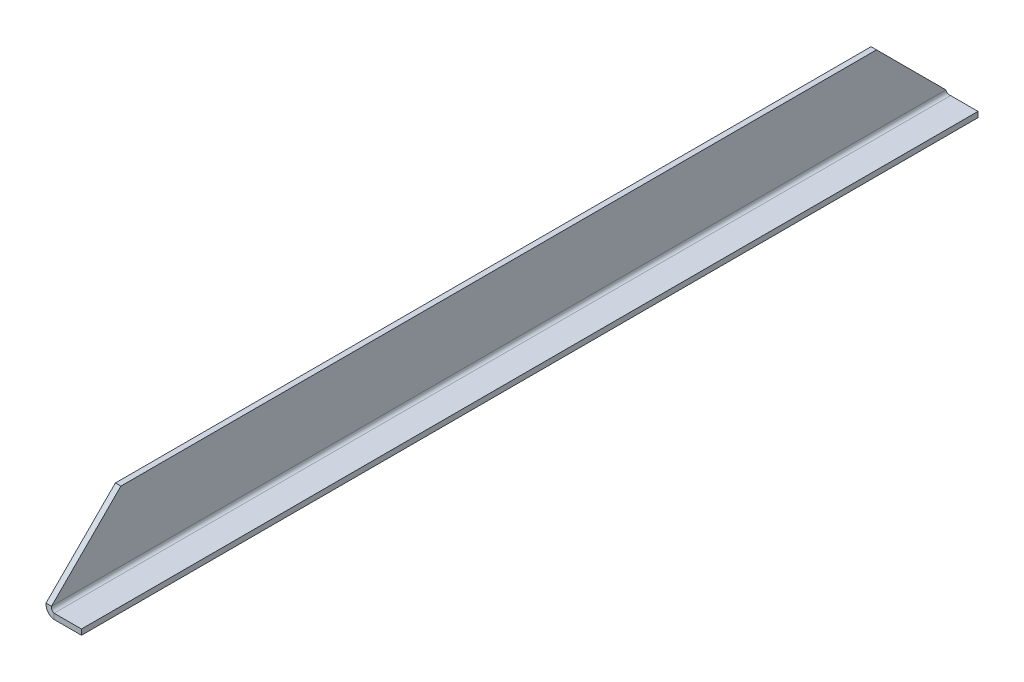
ISO-10303-21;
HEADER;
FILE_DESCRIPTION(('STEP AP214'),'2;1');
FILE_NAME('part.step','',(''),(''),'','','');
FILE_SCHEMA(('AUTOMOTIVE_DESIGN { 1 0 10303 214 1 1 1 1 }'));
ENDSEC;
DATA;
#1=APPLICATION_CONTEXT('core data for automotive mechanical design processes');
#2=APPLICATION_PROTOCOL_DEFINITION('international standard','automotive_design',2000,#1);
#3=PRODUCT_CONTEXT('',#1,'mechanical');
#4=PRODUCT('Part','Part','',(#3));
#5=PRODUCT_RELATED_PRODUCT_CATEGORY('part','',(#4));
#6=PRODUCT_DEFINITION_FORMATION('','',#4);
#7=PRODUCT_DEFINITION_CONTEXT('part definition',#1,'design');
#8=PRODUCT_DEFINITION('design','',#6,#7);
#9=PRODUCT_DEFINITION_SHAPE('','',#8);
#10=(LENGTH_UNIT() NAMED_UNIT(*) SI_UNIT(.MILLI.,.METRE.));
#11=(NAMED_UNIT(*) PLANE_ANGLE_UNIT() SI_UNIT($,.RADIAN.));
#12=(NAMED_UNIT(*) SI_UNIT($,.STERADIAN.) SOLID_ANGLE_UNIT());
#13=UNCERTAINTY_MEASURE_WITH_UNIT(LENGTH_MEASURE(1.E-05),#10,'distance_accuracy_value','');
#14=(GEOMETRIC_REPRESENTATION_CONTEXT(3) GLOBAL_UNCERTAINTY_ASSIGNED_CONTEXT((#13)) GLOBAL_UNIT_ASSIGNED_CONTEXT((#10,
#11,#12)) REPRESENTATION_CONTEXT('',''));
#15=CARTESIAN_POINT('',(0.,0.,0.));
#16=DIRECTION('',(0.,0.,1.));
#17=DIRECTION('',(1.,0.,0.));
#18=AXIS2_PLACEMENT_3D('',#15,#16,#17);
#19=CARTESIAN_POINT('',(0.,-1200.,0.));
#20=DIRECTION('',(0.,-1.,0.));
#21=DIRECTION('',(1.,0.,0.));
#22=AXIS2_PLACEMENT_3D('',#19,#20,#21);
#23=PLANE('',#22);
#24=DIRECTION('',(-1.,0.,0.));
#25=VECTOR('',#24,1.);
#26=CARTESIAN_POINT('',(-1168.49999999999,-1200.,857.792893218825));
#27=LINE('',#26,#25);
#28=CARTESIAN_POINT('',(-1159.99999999999,-1200.,857.792893218824));
#29=VERTEX_POINT('',#28);
#30=CARTESIAN_POINT('',(-1167.49999999999,-1200.,857.792893218825));
#31=VERTEX_POINT('',#30);
#32=EDGE_CURVE('E204',#29,#31,#27,.T.);
#33=ORIENTED_EDGE('',*,*,#32,.T.);
#34=DIRECTION('',(0.,0.,1.));
#35=VECTOR('',#34,1.);
#36=CARTESIAN_POINT('',(-1167.49999999999,-1200.,857.792893218825));
#37=LINE('',#36,#35);
#38=CARTESIAN_POINT('',(-1167.49999999999,-1200.,612.207106781198));
#39=VERTEX_POINT('',#38);
#40=EDGE_CURVE('E180',#39,#31,#37,.T.);
#41=ORIENTED_EDGE('',*,*,#40,.F.);
#42=DIRECTION('',(-1.,0.,0.));
#43=VECTOR('',#42,1.);
#44=CARTESIAN_POINT('',(-1168.49999999999,-1200.,612.207106781198));
#45=LINE('',#44,#43);
#46=CARTESIAN_POINT('',(-1159.99999999999,-1200.,612.207106781198));
#47=VERTEX_POINT('',#46);
#48=EDGE_CURVE('E351',#47,#39,#45,.T.);
#49=ORIENTED_EDGE('',*,*,#48,.F.);
#50=DIRECTION('',(0.,0.,-1.));
#51=VECTOR('',#50,1.);
#52=CARTESIAN_POINT('',(-1159.99999999999,-1200.,858.500000000011));
#53=LINE('',#52,#51);
#54=EDGE_CURVE('E82',#29,#47,#53,.T.);
#55=ORIENTED_EDGE('',*,*,#54,.F.);
#56=EDGE_LOOP('',(#33,#41,#49,#55));
#57=FACE_BOUND('',#56,.T.);
#58=ADVANCED_FACE('F59',(#57),#23,.T.);
#59=CARTESIAN_POINT('',(-1159.99999999999,-707.099436303997,0.));
#60=DIRECTION('',(1.,0.,0.));
#61=DIRECTION('',(0.,0.,-1.));
#62=AXIS2_PLACEMENT_3D('',#59,#60,#61);
#63=PLANE('',#62);
#64=DIRECTION('',(0.,-1.,0.));
#65=VECTOR('',#64,1.);
#66=CARTESIAN_POINT('',(-1159.99999999999,-707.099436303997,857.792893218825));
#67=LINE('',#66,#65);
#68=CARTESIAN_POINT('',(-1159.99999999999,-1198.5,857.792893218825));
#69=VERTEX_POINT('',#68);
#70=EDGE_CURVE('E363',#69,#29,#67,.T.);
#71=ORIENTED_EDGE('',*,*,#70,.T.);
#72=ORIENTED_EDGE('',*,*,#54,.T.);
#73=DIRECTION('',(0.,-1.,0.));
#74=VECTOR('',#73,1.);
#75=CARTESIAN_POINT('',(-1159.99999999999,-707.099436303997,612.207106781198));
#76=LINE('',#75,#74);
#77=CARTESIAN_POINT('',(-1159.99999999999,-1198.5,612.207106781198));
#78=VERTEX_POINT('',#77);
#79=EDGE_CURVE('E14',#78,#47,#76,.T.);
#80=ORIENTED_EDGE('',*,*,#79,.F.);
#81=DIRECTION('',(0.,0.,1.));
#82=VECTOR('',#81,1.);
#83=CARTESIAN_POINT('',(-1159.99999999999,-1198.5,0.));
#84=LINE('',#83,#82);
#85=EDGE_CURVE('E358',#78,#69,#84,.T.);
#86=ORIENTED_EDGE('',*,*,#85,.T.);
#87=EDGE_LOOP('',(#71,#72,#80,#86));
#88=FACE_BOUND('',#87,.T.);
#89=ADVANCED_FACE('F61',(#88),#63,.T.);
#90=CARTESIAN_POINT('',(0.,-707.099436303997,612.207106781198));
#91=DIRECTION('',(0.,0.,-1.));
#92=DIRECTION('',(-1.,0.,0.));
#93=AXIS2_PLACEMENT_3D('',#90,#91,#92);
#94=PLANE('',#93);
#95=ORIENTED_EDGE('',*,*,#79,.T.);
#96=ORIENTED_EDGE('',*,*,#48,.T.);
#97=CARTESIAN_POINT('',(-1167.49999999999,-1198.5,612.207106781198));
#98=CARTESIAN_POINT('',(-1167.49999999999,-1200.,612.207106781198));
#99=B_SPLINE_CURVE_WITH_KNOTS('',1,(#97,#98),.UNSPECIFIED.,.F.,.F.,(2,2),(0.,1.),.UNSPECIFIED.);
#100=CARTESIAN_POINT('',(-1167.49999999999,-1198.5,612.207106781198));
#101=VERTEX_POINT('',#100);
#102=EDGE_CURVE('E71',#101,#39,#99,.T.);
#103=ORIENTED_EDGE('',*,*,#102,.F.);
#104=DIRECTION('',(1.,0.,0.));
#105=VECTOR('',#104,1.);
#106=CARTESIAN_POINT('',(0.,-1198.5,612.207106781198));
#107=LINE('',#106,#105);
#108=EDGE_CURVE('E92',#101,#78,#107,.T.);
#109=ORIENTED_EDGE('',*,*,#108,.T.);
#110=EDGE_LOOP('',(#95,#96,#103,#109));
#111=FACE_BOUND('',#110,.T.);
#112=ADVANCED_FACE('F389',(#111),#94,.T.);
#113=CARTESIAN_POINT('',(0.,-707.099436303997,857.792893218824));
#114=DIRECTION('',(0.,0.,1.));
#115=DIRECTION('',(1.,0.,0.));
#116=AXIS2_PLACEMENT_3D('',#113,#114,#115);
#117=PLANE('',#116);
#118=CARTESIAN_POINT('',(-1167.49999999999,-1200.,857.792893218825));
#119=CARTESIAN_POINT('',(-1167.49999999999,-1198.5,857.792893218825));
#120=B_SPLINE_CURVE_WITH_KNOTS('',1,(#118,#119),.UNSPECIFIED.,.F.,.F.,(2,2),(0.,1.),.UNSPECIFIED.);
#121=CARTESIAN_POINT('',(-1167.49999999999,-1198.5,857.792893218825));
#122=VERTEX_POINT('',#121);
#123=EDGE_CURVE('E292',#122,#31,#120,.F.);
#124=ORIENTED_EDGE('',*,*,#123,.T.);
#125=ORIENTED_EDGE('',*,*,#32,.F.);
#126=ORIENTED_EDGE('',*,*,#70,.F.);
#127=DIRECTION('',(1.,0.,0.));
#128=VECTOR('',#127,1.);
#129=CARTESIAN_POINT('',(0.,-1198.5,857.792893218824));
#130=LINE('',#129,#128);
#131=EDGE_CURVE('E366',#69,#122,#130,.F.);
#132=ORIENTED_EDGE('',*,*,#131,.T.);
#133=EDGE_LOOP('',(#124,#125,#126,#132));
#134=FACE_BOUND('',#133,.T.);
#135=ADVANCED_FACE('F380',(#134),#117,.T.);
#136=CARTESIAN_POINT('',(0.,-1198.5,0.));
#137=DIRECTION('',(0.,-1.,0.));
#138=DIRECTION('',(1.,0.,0.));
#139=AXIS2_PLACEMENT_3D('',#136,#137,#138);
#140=PLANE('',#139);
#141=ORIENTED_EDGE('',*,*,#85,.F.);
#142=ORIENTED_EDGE('',*,*,#108,.F.);
#143=DIRECTION('',(0.,0.,1.));
#144=VECTOR('',#143,1.);
#145=CARTESIAN_POINT('',(-1167.49999999999,-1198.5,857.792893218825));
#146=LINE('',#145,#144);
#147=EDGE_CURVE('E370',#101,#122,#146,.T.);
#148=ORIENTED_EDGE('',*,*,#147,.T.);
#149=ORIENTED_EDGE('',*,*,#131,.F.);
#150=EDGE_LOOP('',(#141,#142,#148,#149));
#151=FACE_BOUND('',#150,.T.);
#152=ADVANCED_FACE('F395',(#151),#140,.F.);
#153=CARTESIAN_POINT('',(-677.028739395678,-1178.5,6.60051466951424E-12));
#154=DIRECTION('',(0.,1.,0.));
#155=DIRECTION('',(-1.,0.,0.));
#156=AXIS2_PLACEMENT_3D('',#153,#154,#155);
#157=PLANE('',#156);
#158=DIRECTION('',(-1.,0.,0.));
#159=VECTOR('',#158,1.);
#160=CARTESIAN_POINT('',(-677.028739395672,-1178.5,631.500000000007));
#161=LINE('',#160,#159);
#162=CARTESIAN_POINT('',(-1168.49999999999,-1178.5,631.500000000011));
#163=VERTEX_POINT('',#162);
#164=CARTESIAN_POINT('',(-1169.99999999999,-1178.5,631.500000000011));
#165=VERTEX_POINT('',#164);
#166=EDGE_CURVE('E166',#163,#165,#161,.T.);
#167=ORIENTED_EDGE('',*,*,#166,.T.);
#168=DIRECTION('',(0.,0.,1.));
#169=VECTOR('',#168,1.);
#170=CARTESIAN_POINT('',(-1169.99999999999,-1178.5,838.500000000011));
#171=LINE('',#170,#169);
#172=CARTESIAN_POINT('',(-1169.99999999999,-1178.5,838.500000000011));
#173=VERTEX_POINT('',#172);
#174=EDGE_CURVE('E324',#173,#165,#171,.F.);
#175=ORIENTED_EDGE('',*,*,#174,.F.);
#176=DIRECTION('',(-1.,0.,0.));
#177=VECTOR('',#176,1.);
#178=CARTESIAN_POINT('',(-677.028739395671,-1178.5,838.500000000006));
#179=LINE('',#178,#177);
#180=CARTESIAN_POINT('',(-1168.49999999999,-1178.5,838.500000000011));
#181=VERTEX_POINT('',#180);
#182=EDGE_CURVE('E199',#181,#173,#179,.T.);
#183=ORIENTED_EDGE('',*,*,#182,.F.);
#184=DIRECTION('',(0.,0.,1.));
#185=VECTOR('',#184,1.);
#186=CARTESIAN_POINT('',(-1168.5,-1178.5,1.13919852179566E-11));
#187=LINE('',#186,#185);
#188=EDGE_CURVE('E327',#181,#163,#187,.F.);
#189=ORIENTED_EDGE('',*,*,#188,.T.);
#190=EDGE_LOOP('',(#167,#175,#183,#189));
#191=FACE_BOUND('',#190,.T.);
#192=ADVANCED_FACE('F408',(#191),#157,.T.);
#193=CARTESIAN_POINT('',(-1168.5,-3.66373598126302E-12,1.13919852179567E-11));
#194=DIRECTION('',(-1.,0.,0.));
#195=DIRECTION('',(0.,0.,1.));
#196=AXIS2_PLACEMENT_3D('',#193,#194,#195);
#197=PLANE('',#196);
#198=DIRECTION('',(0.,-0.707106781186548,-0.707106781186548));
#199=VECTOR('',#198,1.);
#200=CARTESIAN_POINT('',(-1168.49999999999,-905.000000000002,905.00000000001));
#201=LINE('',#200,#199);
#202=CARTESIAN_POINT('',(-1168.49999999999,-1197.5,612.500000000011));
#203=VERTEX_POINT('',#202);
#204=EDGE_CURVE('E224',#163,#203,#201,.T.);
#205=ORIENTED_EDGE('',*,*,#204,.F.);
#206=ORIENTED_EDGE('',*,*,#188,.F.);
#207=DIRECTION('',(0.,-0.70710678118655,0.707106781186546));
#208=VECTOR('',#207,1.);
#209=CARTESIAN_POINT('',(-1168.5,-169.999999999999,-169.999999999985));
#210=LINE('',#209,#208);
#211=CARTESIAN_POINT('',(-1168.49999999999,-1197.5,857.500000000011));
#212=VERTEX_POINT('',#211);
#213=EDGE_CURVE('E231',#181,#212,#210,.T.);
#214=ORIENTED_EDGE('',*,*,#213,.T.);
#215=DIRECTION('',(0.,0.,1.));
#216=VECTOR('',#215,1.);
#217=CARTESIAN_POINT('',(-1168.5,-1197.5,1.13919852179566E-11));
#218=LINE('',#217,#216);
#219=EDGE_CURVE('E167',#203,#212,#218,.T.);
#220=ORIENTED_EDGE('',*,*,#219,.F.);
#221=EDGE_LOOP('',(#205,#206,#214,#220));
#222=FACE_BOUND('',#221,.T.);
#223=ADVANCED_FACE('F414',(#222),#197,.F.);
#224=CARTESIAN_POINT('',(-677.028739395671,-905.,905.000000000005));
#225=DIRECTION('',(0.,0.707106781186547,-0.707106781186547));
#226=DIRECTION('',(0.,0.707106781186548,0.707106781186548));
#227=AXIS2_PLACEMENT_3D('',#224,#225,#226);
#228=PLANE('',#227);
#229=CARTESIAN_POINT('',(-1169.99999999999,-1197.5,612.500000000011));
#230=CARTESIAN_POINT('',(-1168.49999999999,-1197.5,612.500000000011));
#231=B_SPLINE_CURVE_WITH_KNOTS('',1,(#229,#230),.UNSPECIFIED.,.F.,.F.,(2,2),(0.,1.),.UNSPECIFIED.);
#232=CARTESIAN_POINT('',(-1169.99999999999,-1197.5,612.500000000011));
#233=VERTEX_POINT('',#232);
#234=EDGE_CURVE('E314',#203,#233,#231,.F.);
#235=ORIENTED_EDGE('',*,*,#234,.T.);
#236=DIRECTION('',(0.,-0.707106781186548,-0.707106781186548));
#237=VECTOR('',#236,1.);
#238=CARTESIAN_POINT('',(-1169.99999999999,-905.000000000002,905.00000000001));
#239=LINE('',#238,#237);
#240=EDGE_CURVE('E192',#165,#233,#239,.T.);
#241=ORIENTED_EDGE('',*,*,#240,.F.);
#242=ORIENTED_EDGE('',*,*,#166,.F.);
#243=ORIENTED_EDGE('',*,*,#204,.T.);
#244=EDGE_LOOP('',(#235,#241,#242,#243));
#245=FACE_BOUND('',#244,.T.);
#246=ADVANCED_FACE('F456',(#245),#228,.T.);
#247=CARTESIAN_POINT('',(-1170.,-3.66373598126302E-12,1.14066090757461E-11));
#248=DIRECTION('',(-1.,0.,0.));
#249=DIRECTION('',(0.,0.,1.));
#250=AXIS2_PLACEMENT_3D('',#247,#248,#249);
#251=PLANE('',#250);
#252=ORIENTED_EDGE('',*,*,#174,.T.);
#253=ORIENTED_EDGE('',*,*,#240,.T.);
#254=DIRECTION('',(0.,0.,1.));
#255=VECTOR('',#254,1.);
#256=CARTESIAN_POINT('',(-1170.,-1197.5,1.14066090757461E-11));
#257=LINE('',#256,#255);
#258=CARTESIAN_POINT('',(-1169.99999999999,-1197.5,857.500000000011));
#259=VERTEX_POINT('',#258);
#260=EDGE_CURVE('E177',#233,#259,#257,.T.);
#261=ORIENTED_EDGE('',*,*,#260,.T.);
#262=DIRECTION('',(0.,-0.70710678118655,0.707106781186546));
#263=VECTOR('',#262,1.);
#264=CARTESIAN_POINT('',(-1170.,-169.999999999999,-169.999999999984));
#265=LINE('',#264,#263);
#266=EDGE_CURVE('E189',#173,#259,#265,.T.);
#267=ORIENTED_EDGE('',*,*,#266,.F.);
#268=EDGE_LOOP('',(#252,#253,#261,#267));
#269=FACE_BOUND('',#268,.T.);
#270=ADVANCED_FACE('F188',(#269),#251,.T.);
#271=CARTESIAN_POINT('',(-677.028739395683,-169.999999999997,-169.999999999989));
#272=DIRECTION('',(0.,-0.707106781186546,-0.70710678118655));
#273=DIRECTION('',(0.,0.70710678118655,-0.707106781186546));
#274=AXIS2_PLACEMENT_3D('',#271,#272,#273);
#275=PLANE('',#274);
#276=ORIENTED_EDGE('',*,*,#266,.T.);
#277=CARTESIAN_POINT('',(-1168.49999999999,-1197.5,857.500000000011));
#278=CARTESIAN_POINT('',(-1169.99999999999,-1197.5,857.500000000011));
#279=B_SPLINE_CURVE_WITH_KNOTS('',1,(#277,#278),.UNSPECIFIED.,.F.,.F.,(2,2),(0.,1.),.UNSPECIFIED.);
#280=EDGE_CURVE('E151',#212,#259,#279,.T.);
#281=ORIENTED_EDGE('',*,*,#280,.F.);
#282=ORIENTED_EDGE('',*,*,#213,.F.);
#283=ORIENTED_EDGE('',*,*,#182,.T.);
#284=EDGE_LOOP('',(#276,#281,#282,#283));
#285=FACE_BOUND('',#284,.T.);
#286=ADVANCED_FACE('F197',(#285),#275,.F.);
#287=CARTESIAN_POINT('',(-1167.49999999999,-1200.,857.792893218825));
#288=CARTESIAN_POINT('',(-1167.82730791048,-1200.,857.768481074281));
#289=CARTESIAN_POINT('',(-1168.15436971089,-1199.93493169167,857.744077682356));
#290=CARTESIAN_POINT('',(-1168.75904745092,-1199.68446597089,857.695262145887));
#291=CARTESIAN_POINT('',(-1169.03636679993,-1199.499167106,857.670854377652));
#292=CARTESIAN_POINT('',(-1169.49916710599,-1199.03636679994,857.622038841184));
#293=CARTESIAN_POINT('',(-1169.68446597088,-1198.75904745093,857.597631072949));
#294=CARTESIAN_POINT('',(-1169.93493169166,-1198.1543697109,857.54881553648));
#295=CARTESIAN_POINT('',(-1169.99999999999,-1197.82730791049,857.524412144555));
#296=CARTESIAN_POINT('',(-1169.99999999999,-1197.5,857.500000000011));
#297=CARTESIAN_POINT('',(-1167.49999999999,-1198.5,857.792893218825));
#298=CARTESIAN_POINT('',(-1167.63092250177,-1198.5,857.768481197797));
#299=CARTESIAN_POINT('',(-1167.76174788435,-1198.47397267667,857.744077682356));
#300=CARTESIAN_POINT('',(-1168.00361898036,-1198.37378638835,857.695262145887));
#301=CARTESIAN_POINT('',(-1168.11454671997,-1198.2996668424,857.670854377652));
#302=CARTESIAN_POINT('',(-1168.29966684239,-1198.11454671998,857.622038841184));
#303=CARTESIAN_POINT('',(-1168.37378638835,-1198.00361898037,857.597631072949));
#304=CARTESIAN_POINT('',(-1168.47397267666,-1197.76174788436,857.54881553648));
#305=CARTESIAN_POINT('',(-1168.49999999999,-1197.63092250177,857.524412021039));
#306=CARTESIAN_POINT('',(-1168.49999999999,-1197.5,857.500000000011));
#307=B_SPLINE_SURFACE_WITH_KNOTS('',1,3,((#287,#288,#289,#290,#291,#292,#293,#294,#295,#296),
(#297,#298,#299,#300,#301,#302,#303,#304,#305,#306)),.UNSPECIFIED.,.F.,.F.,.F.,(2,2),(4,2,2,2,
4),(0.,1.),(0.,0.25,0.5,0.75,1.),.UNSPECIFIED.);
#308=CARTESIAN_POINT('',(-1167.49999999999,-1198.5,857.792893218825));
#309=CARTESIAN_POINT('',(-1167.63092250177,-1198.5,857.768481197797));
#310=CARTESIAN_POINT('',(-1167.76174788435,-1198.47397267667,857.744077682356));
#311=CARTESIAN_POINT('',(-1168.00361898036,-1198.37378638835,857.695262145887));
#312=CARTESIAN_POINT('',(-1168.11454671997,-1198.2996668424,857.670854377652));
#313=CARTESIAN_POINT('',(-1168.29966684239,-1198.11454671998,857.622038841184));
#314=CARTESIAN_POINT('',(-1168.37378638835,-1198.00361898037,857.597631072949));
#315=CARTESIAN_POINT('',(-1168.47397267666,-1197.76174788436,857.54881553648));
#316=CARTESIAN_POINT('',(-1168.49999999999,-1197.63092250177,857.524412021039));
#317=CARTESIAN_POINT('',(-1168.49999999999,-1197.5,857.500000000011));
#318=B_SPLINE_CURVE_WITH_KNOTS('',3,(#308,#309,#310,#311,#312,#313,#314,#315,#316,#317),
.UNSPECIFIED.,.F.,.F.,(4,2,2,2,4),(0.,0.25,0.5,0.75,1.),.UNSPECIFIED.);
#319=EDGE_CURVE('E159',#122,#212,#318,.T.);
#320=CARTESIAN_POINT('',(-1169.99999999999,-1197.5,857.500000000011));
#321=CARTESIAN_POINT('',(-1169.99999999999,-1197.82730791049,857.524412144555));
#322=CARTESIAN_POINT('',(-1169.93493169166,-1198.1543697109,857.54881553648));
#323=CARTESIAN_POINT('',(-1169.68446597088,-1198.75904745093,857.597631072949));
#324=CARTESIAN_POINT('',(-1169.49916710599,-1199.03636679994,857.622038841184));
#325=CARTESIAN_POINT('',(-1169.03636679993,-1199.499167106,857.670854377652));
#326=CARTESIAN_POINT('',(-1168.75904745092,-1199.68446597089,857.695262145887));
#327=CARTESIAN_POINT('',(-1168.15436971089,-1199.93493169167,857.744077682356));
#328=CARTESIAN_POINT('',(-1167.82730791048,-1200.,857.768481074281));
#329=CARTESIAN_POINT('',(-1167.49999999999,-1200.,857.792893218825));
#330=B_SPLINE_CURVE_WITH_KNOTS('',3,(#320,#321,#322,#323,#324,#325,#326,#327,#328,#329),
.UNSPECIFIED.,.F.,.F.,(4,2,2,2,4),(0.,0.25,0.5,0.75,1.),.UNSPECIFIED.);
#331=EDGE_CURVE('E156',#31,#259,#330,.F.);
#332=ORIENTED_EDGE('',*,*,#123,.F.);
#333=ORIENTED_EDGE('',*,*,#319,.T.);
#334=ORIENTED_EDGE('',*,*,#280,.T.);
#335=ORIENTED_EDGE('',*,*,#331,.F.);
#336=EDGE_LOOP('',(#332,#333,#334,#335));
#337=FACE_BOUND('',#336,.T.);
#338=ADVANCED_FACE('F155',(#337),#307,.T.);
#339=CARTESIAN_POINT('',(-1169.99999999999,-1197.5,612.500000000011));
#340=CARTESIAN_POINT('',(-1169.99999999999,-1197.82730791049,612.475587855468));
#341=CARTESIAN_POINT('',(-1169.93493169166,-1198.1543697109,612.451184463542));
#342=CARTESIAN_POINT('',(-1169.68446597088,-1198.75904745093,612.402368927074));
#343=CARTESIAN_POINT('',(-1169.49916710599,-1199.03636679994,612.377961158839));
#344=CARTESIAN_POINT('',(-1169.03636679993,-1199.499167106,612.32914562237));
#345=CARTESIAN_POINT('',(-1168.75904745092,-1199.68446597089,612.304737854136));
#346=CARTESIAN_POINT('',(-1168.15436971089,-1199.93493169167,612.255922317667));
#347=CARTESIAN_POINT('',(-1167.82730791048,-1200.,612.231518925742));
#348=CARTESIAN_POINT('',(-1167.49999999999,-1200.,612.207106781198));
#349=CARTESIAN_POINT('',(-1168.49999999999,-1197.5,612.500000000011));
#350=CARTESIAN_POINT('',(-1168.49999999999,-1197.63092250178,612.475587978983));
#351=CARTESIAN_POINT('',(-1168.47397267666,-1197.76174788436,612.451184463542));
#352=CARTESIAN_POINT('',(-1168.37378638835,-1198.00361898037,612.402368927074));
#353=CARTESIAN_POINT('',(-1168.29966684239,-1198.11454671998,612.377961158839));
#354=CARTESIAN_POINT('',(-1168.11454671997,-1198.2996668424,612.32914562237));
#355=CARTESIAN_POINT('',(-1168.00361898036,-1198.37378638835,612.304737854136));
#356=CARTESIAN_POINT('',(-1167.76174788435,-1198.47397267667,612.255922317667));
#357=CARTESIAN_POINT('',(-1167.63092250177,-1198.5,612.231518802226));
#358=CARTESIAN_POINT('',(-1167.49999999999,-1198.5,612.207106781198));
#359=B_SPLINE_SURFACE_WITH_KNOTS('',1,3,((#339,#340,#341,#342,#343,#344,#345,#346,#347,#348),
(#349,#350,#351,#352,#353,#354,#355,#356,#357,#358)),.UNSPECIFIED.,.F.,.F.,.F.,(2,2),(4,2,2,2,
4),(0.,1.),(0.,0.25,0.5,0.75,1.),.UNSPECIFIED.);
#360=CARTESIAN_POINT('',(-1168.49999999999,-1197.5,612.500000000011));
#361=CARTESIAN_POINT('',(-1168.49999999999,-1197.63092250178,612.475587978983));
#362=CARTESIAN_POINT('',(-1168.47397267666,-1197.76174788436,612.451184463542));
#363=CARTESIAN_POINT('',(-1168.37378638835,-1198.00361898037,612.402368927074));
#364=CARTESIAN_POINT('',(-1168.29966684239,-1198.11454671998,612.377961158839));
#365=CARTESIAN_POINT('',(-1168.11454671997,-1198.2996668424,612.32914562237));
#366=CARTESIAN_POINT('',(-1168.00361898036,-1198.37378638835,612.304737854136));
#367=CARTESIAN_POINT('',(-1167.76174788435,-1198.47397267667,612.255922317667));
#368=CARTESIAN_POINT('',(-1167.63092250177,-1198.5,612.231518802226));
#369=CARTESIAN_POINT('',(-1167.49999999999,-1198.5,612.207106781198));
#370=B_SPLINE_CURVE_WITH_KNOTS('',3,(#360,#361,#362,#363,#364,#365,#366,#367,#368,#369),
.UNSPECIFIED.,.F.,.F.,(4,2,2,2,4),(0.,0.25,0.5,0.75,1.),.UNSPECIFIED.);
#371=EDGE_CURVE('E183',#203,#101,#370,.T.);
#372=CARTESIAN_POINT('',(-1167.49999999999,-1200.,612.207106781198));
#373=CARTESIAN_POINT('',(-1167.82730791048,-1200.,612.231518925742));
#374=CARTESIAN_POINT('',(-1168.15436971089,-1199.93493169167,612.255922317667));
#375=CARTESIAN_POINT('',(-1168.75904745092,-1199.68446597089,612.304737854136));
#376=CARTESIAN_POINT('',(-1169.03636679993,-1199.499167106,612.32914562237));
#377=CARTESIAN_POINT('',(-1169.49916710599,-1199.03636679994,612.377961158839));
#378=CARTESIAN_POINT('',(-1169.68446597088,-1198.75904745093,612.402368927074));
#379=CARTESIAN_POINT('',(-1169.93493169166,-1198.1543697109,612.451184463542));
#380=CARTESIAN_POINT('',(-1169.99999999999,-1197.82730791049,612.475587855468));
#381=CARTESIAN_POINT('',(-1169.99999999999,-1197.5,612.500000000011));
#382=B_SPLINE_CURVE_WITH_KNOTS('',3,(#372,#373,#374,#375,#376,#377,#378,#379,#380,#381),
.UNSPECIFIED.,.F.,.F.,(4,2,2,2,4),(0.,0.25,0.5,0.75,1.),.UNSPECIFIED.);
#383=EDGE_CURVE('E182',#233,#39,#382,.F.);
#384=ORIENTED_EDGE('',*,*,#371,.T.);
#385=ORIENTED_EDGE('',*,*,#102,.T.);
#386=ORIENTED_EDGE('',*,*,#383,.F.);
#387=ORIENTED_EDGE('',*,*,#234,.F.);
#388=EDGE_LOOP('',(#384,#385,#386,#387));
#389=FACE_BOUND('',#388,.T.);
#390=ADVANCED_FACE('F265',(#389),#359,.T.);
#391=CARTESIAN_POINT('',(-1167.49999999999,-1197.5,1104.94308730675));
#392=DIRECTION('',(0.,0.,-1.));
#393=DIRECTION('',(-1.,0.,0.));
#394=AXIS2_PLACEMENT_3D('',#391,#392,#393);
#395=CYLINDRICAL_SURFACE('',#394,2.50000000000004);
#396=ORIENTED_EDGE('',*,*,#260,.F.);
#397=ORIENTED_EDGE('',*,*,#383,.T.);
#398=ORIENTED_EDGE('',*,*,#40,.T.);
#399=ORIENTED_EDGE('',*,*,#331,.T.);
#400=EDGE_LOOP('',(#396,#397,#398,#399));
#401=FACE_BOUND('',#400,.T.);
#402=ADVANCED_FACE('F175',(#401),#395,.T.);
#403=CARTESIAN_POINT('',(-1167.49999999999,-1197.5,1104.94308730675));
#404=DIRECTION('',(0.,0.,-1.));
#405=DIRECTION('',(-1.,0.,0.));
#406=AXIS2_PLACEMENT_3D('',#403,#404,#405);
#407=CYLINDRICAL_SURFACE('',#406,0.999999999999984);
#408=ORIENTED_EDGE('',*,*,#219,.T.);
#409=ORIENTED_EDGE('',*,*,#319,.F.);
#410=ORIENTED_EDGE('',*,*,#147,.F.);
#411=ORIENTED_EDGE('',*,*,#371,.F.);
#412=EDGE_LOOP('',(#408,#409,#410,#411));
#413=FACE_BOUND('',#412,.T.);
#414=ADVANCED_FACE('F267',(#413),#407,.F.);
#415=CLOSED_SHELL('',(#58,#89,#112,#135,#152,#192,#223,#246,#270,#286,#338,#390,#402,#414));
#416=MANIFOLD_SOLID_BREP('B2',#415);
#417=ADVANCED_BREP_SHAPE_REPRESENTATION('',(#18,#416),#14);
#418=SHAPE_DEFINITION_REPRESENTATION(#9,#417);
ENDSEC;
END-ISO-10303-21;
